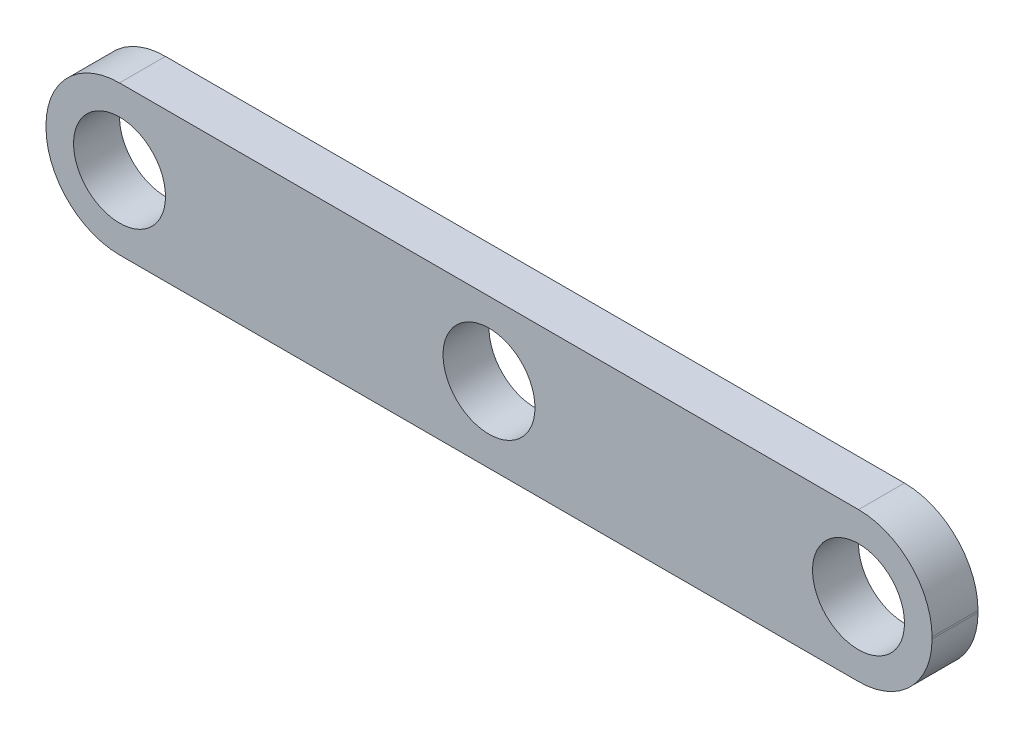
ISO-10303-21;
HEADER;
FILE_DESCRIPTION(('STEP AP214'),'2;1');
FILE_NAME('part.step','',(''),(''),'','','');
FILE_SCHEMA(('AUTOMOTIVE_DESIGN { 1 0 10303 214 1 1 1 1 }'));
ENDSEC;
DATA;
#1=APPLICATION_CONTEXT('core data for automotive mechanical design processes');
#2=APPLICATION_PROTOCOL_DEFINITION('international standard','automotive_design',2000,#1);
#3=PRODUCT_CONTEXT('',#1,'mechanical');
#4=PRODUCT('Part','Part','',(#3));
#5=PRODUCT_RELATED_PRODUCT_CATEGORY('part','',(#4));
#6=PRODUCT_DEFINITION_FORMATION('','',#4);
#7=PRODUCT_DEFINITION_CONTEXT('part definition',#1,'design');
#8=PRODUCT_DEFINITION('design','',#6,#7);
#9=PRODUCT_DEFINITION_SHAPE('','',#8);
#10=(LENGTH_UNIT() NAMED_UNIT(*) SI_UNIT(.MILLI.,.METRE.));
#11=(NAMED_UNIT(*) PLANE_ANGLE_UNIT() SI_UNIT($,.RADIAN.));
#12=(NAMED_UNIT(*) SI_UNIT($,.STERADIAN.) SOLID_ANGLE_UNIT());
#13=UNCERTAINTY_MEASURE_WITH_UNIT(LENGTH_MEASURE(1.E-05),#10,'distance_accuracy_value','');
#14=(GEOMETRIC_REPRESENTATION_CONTEXT(3) GLOBAL_UNCERTAINTY_ASSIGNED_CONTEXT((#13)) GLOBAL_UNIT_ASSIGNED_CONTEXT((#10,
#11,#12)) REPRESENTATION_CONTEXT('',''));
#15=CARTESIAN_POINT('',(0.,0.,0.));
#16=DIRECTION('',(0.,0.,1.));
#17=DIRECTION('',(1.,0.,0.));
#18=AXIS2_PLACEMENT_3D('',#15,#16,#17);
#19=CARTESIAN_POINT('',(-80.7734535156808,-21.6068840336135,10.));
#20=DIRECTION('',(0.,0.,1.));
#21=DIRECTION('',(1.,0.,0.));
#22=AXIS2_PLACEMENT_3D('',#19,#20,#21);
#23=PLANE('',#22);
#24=CARTESIAN_POINT('',(-0.370619440874409,-21.1882318668644,10.));
#25=DIRECTION('',(0.,0.,1.));
#26=DIRECTION('',(1.,0.,0.));
#27=AXIS2_PLACEMENT_3D('',#24,#25,#26);
#28=CIRCLE('',#27,9.99999999999999);
#29=CARTESIAN_POINT('',(9.62938055912559,-21.1882318668644,10.));
#30=VERTEX_POINT('',#29);
#31=EDGE_CURVE('E213',#30,#30,#28,.T.);
#32=ORIENTED_EDGE('',*,*,#31,.F.);
#33=EDGE_LOOP('',(#32));
#34=FACE_BOUND('',#33,.T.);
#35=CARTESIAN_POINT('',(-80.7734535156808,-21.6068840336135,10.));
#36=DIRECTION('',(0.,0.,1.));
#37=DIRECTION('',(1.,0.,0.));
#38=AXIS2_PLACEMENT_3D('',#35,#36,#37);
#39=CIRCLE('',#38,16.);
#40=CARTESIAN_POINT('',(-96.7734535156808,-21.6068840336135,10.));
#41=VERTEX_POINT('',#40);
#42=CARTESIAN_POINT('',(-80.7734535156808,-37.6068840336135,10.));
#43=VERTEX_POINT('',#42);
#44=EDGE_CURVE('E164',#41,#43,#39,.T.);
#45=ORIENTED_EDGE('',*,*,#44,.T.);
#46=DIRECTION('',(1.,0.,0.));
#47=VECTOR('',#46,1.);
#48=CARTESIAN_POINT('',(-80.7734535156808,-37.6068840336135,10.));
#49=LINE('',#48,#47);
#50=CARTESIAN_POINT('',(80.032214633932,-37.6068840336135,10.));
#51=VERTEX_POINT('',#50);
#52=EDGE_CURVE('E100',#43,#51,#49,.T.);
#53=ORIENTED_EDGE('',*,*,#52,.T.);
#54=CARTESIAN_POINT('',(80.032214633932,-21.6068840336134,10.));
#55=DIRECTION('',(0.,0.,1.));
#56=DIRECTION('',(1.,0.,0.));
#57=AXIS2_PLACEMENT_3D('',#54,#55,#56);
#58=CIRCLE('',#57,16.);
#59=CARTESIAN_POINT('',(96.032214633932,-21.6068840336134,10.));
#60=VERTEX_POINT('',#59);
#61=EDGE_CURVE('E185',#51,#60,#58,.T.);
#62=ORIENTED_EDGE('',*,*,#61,.T.);
#63=DIRECTION('',(0.,1.,0.));
#64=VECTOR('',#63,1.);
#65=CARTESIAN_POINT('',(96.032214633932,-21.1882318668644,10.));
#66=LINE('',#65,#64);
#67=CARTESIAN_POINT('',(96.032214633932,-21.1882318668644,10.));
#68=VERTEX_POINT('',#67);
#69=EDGE_CURVE('E199',#60,#68,#66,.T.);
#70=ORIENTED_EDGE('',*,*,#69,.T.);
#71=CARTESIAN_POINT('',(80.032214633932,-21.1882318668644,10.));
#72=DIRECTION('',(0.,0.,1.));
#73=DIRECTION('',(-1.,0.,0.));
#74=AXIS2_PLACEMENT_3D('',#71,#72,#73);
#75=CIRCLE('',#74,16.);
#76=CARTESIAN_POINT('',(80.032214633932,-5.1882318668644,10.));
#77=VERTEX_POINT('',#76);
#78=EDGE_CURVE('E119',#68,#77,#75,.T.);
#79=ORIENTED_EDGE('',*,*,#78,.T.);
#80=DIRECTION('',(-1.,0.,0.));
#81=VECTOR('',#80,1.);
#82=CARTESIAN_POINT('',(-80.7734535156808,-5.1882318668644,10.));
#83=LINE('',#82,#81);
#84=CARTESIAN_POINT('',(-80.7734535156808,-5.1882318668644,10.));
#85=VERTEX_POINT('',#84);
#86=EDGE_CURVE('E113',#77,#85,#83,.T.);
#87=ORIENTED_EDGE('',*,*,#86,.T.);
#88=CARTESIAN_POINT('',(-80.7734535156808,-21.1882318668644,10.));
#89=DIRECTION('',(0.,0.,1.));
#90=DIRECTION('',(1.,0.,0.));
#91=AXIS2_PLACEMENT_3D('',#88,#89,#90);
#92=CIRCLE('',#91,16.);
#93=CARTESIAN_POINT('',(-96.7734535156808,-21.1882318668644,10.));
#94=VERTEX_POINT('',#93);
#95=EDGE_CURVE('E117',#85,#94,#92,.T.);
#96=ORIENTED_EDGE('',*,*,#95,.T.);
#97=DIRECTION('',(0.,-1.,0.));
#98=VECTOR('',#97,1.);
#99=CARTESIAN_POINT('',(-96.7734535156808,-21.1882318668644,10.));
#100=LINE('',#99,#98);
#101=EDGE_CURVE('E57',#94,#41,#100,.T.);
#102=ORIENTED_EDGE('',*,*,#101,.T.);
#103=EDGE_LOOP('',(#45,#53,#62,#70,#79,#87,#96,#102));
#104=FACE_BOUND('',#103,.T.);
#105=CARTESIAN_POINT('',(-80.7734535156808,-21.6068840336135,10.));
#106=DIRECTION('',(0.,0.,1.));
#107=DIRECTION('',(1.,0.,0.));
#108=AXIS2_PLACEMENT_3D('',#105,#106,#107);
#109=CIRCLE('',#108,9.99999999999999);
#110=CARTESIAN_POINT('',(-70.7734535156808,-21.6068840336135,10.));
#111=VERTEX_POINT('',#110);
#112=EDGE_CURVE('E146',#111,#111,#109,.T.);
#113=ORIENTED_EDGE('',*,*,#112,.F.);
#114=EDGE_LOOP('',(#113));
#115=FACE_BOUND('',#114,.T.);
#116=CARTESIAN_POINT('',(80.032214633932,-21.6068840336134,10.));
#117=DIRECTION('',(0.,0.,1.));
#118=DIRECTION('',(1.,0.,0.));
#119=AXIS2_PLACEMENT_3D('',#116,#117,#118);
#120=CIRCLE('',#119,9.99999999999999);
#121=CARTESIAN_POINT('',(90.032214633932,-21.6068840336134,10.));
#122=VERTEX_POINT('',#121);
#123=EDGE_CURVE('E221',#122,#122,#120,.T.);
#124=ORIENTED_EDGE('',*,*,#123,.F.);
#125=EDGE_LOOP('',(#124));
#126=FACE_BOUND('',#125,.T.);
#127=ADVANCED_FACE('F39',(#34,#104,#115,#126),#23,.T.);
#128=CARTESIAN_POINT('',(-80.7734535156808,-21.6068840336135,0.));
#129=DIRECTION('',(0.,0.,1.));
#130=DIRECTION('',(1.,0.,0.));
#131=AXIS2_PLACEMENT_3D('',#128,#129,#130);
#132=PLANE('',#131);
#133=CARTESIAN_POINT('',(-80.7734535156808,-21.6068840336135,0.));
#134=DIRECTION('',(0.,0.,1.));
#135=DIRECTION('',(1.,0.,0.));
#136=AXIS2_PLACEMENT_3D('',#133,#134,#135);
#137=CIRCLE('',#136,16.);
#138=CARTESIAN_POINT('',(-96.7734535156808,-21.6068840336135,0.));
#139=VERTEX_POINT('',#138);
#140=CARTESIAN_POINT('',(-80.7734535156808,-37.6068840336135,0.));
#141=VERTEX_POINT('',#140);
#142=EDGE_CURVE('E141',#139,#141,#137,.T.);
#143=ORIENTED_EDGE('',*,*,#142,.F.);
#144=DIRECTION('',(0.,-1.,0.));
#145=VECTOR('',#144,1.);
#146=CARTESIAN_POINT('',(-96.7734535156808,-21.1882318668644,0.));
#147=LINE('',#146,#145);
#148=CARTESIAN_POINT('',(-96.7734535156808,-21.1882318668644,0.));
#149=VERTEX_POINT('',#148);
#150=EDGE_CURVE('E92',#149,#139,#147,.T.);
#151=ORIENTED_EDGE('',*,*,#150,.F.);
#152=CARTESIAN_POINT('',(-80.7734535156808,-21.1882318668644,0.));
#153=DIRECTION('',(0.,0.,1.));
#154=DIRECTION('',(1.,0.,0.));
#155=AXIS2_PLACEMENT_3D('',#152,#153,#154);
#156=CIRCLE('',#155,16.);
#157=CARTESIAN_POINT('',(-80.7734535156808,-5.1882318668644,0.));
#158=VERTEX_POINT('',#157);
#159=EDGE_CURVE('E86',#158,#149,#156,.T.);
#160=ORIENTED_EDGE('',*,*,#159,.F.);
#161=DIRECTION('',(-1.,0.,0.));
#162=VECTOR('',#161,1.);
#163=CARTESIAN_POINT('',(-80.7734535156808,-5.1882318668644,0.));
#164=LINE('',#163,#162);
#165=CARTESIAN_POINT('',(80.032214633932,-5.1882318668644,0.));
#166=VERTEX_POINT('',#165);
#167=EDGE_CURVE('E128',#166,#158,#164,.T.);
#168=ORIENTED_EDGE('',*,*,#167,.F.);
#169=CARTESIAN_POINT('',(80.032214633932,-21.1882318668644,0.));
#170=DIRECTION('',(0.,0.,1.));
#171=DIRECTION('',(-1.,0.,0.));
#172=AXIS2_PLACEMENT_3D('',#169,#170,#171);
#173=CIRCLE('',#172,16.);
#174=CARTESIAN_POINT('',(96.032214633932,-21.1882318668644,0.));
#175=VERTEX_POINT('',#174);
#176=EDGE_CURVE('E155',#175,#166,#173,.T.);
#177=ORIENTED_EDGE('',*,*,#176,.F.);
#178=DIRECTION('',(0.,1.,0.));
#179=VECTOR('',#178,1.);
#180=CARTESIAN_POINT('',(96.032214633932,-21.1882318668644,0.));
#181=LINE('',#180,#179);
#182=CARTESIAN_POINT('',(96.032214633932,-21.6068840336134,0.));
#183=VERTEX_POINT('',#182);
#184=EDGE_CURVE('E152',#183,#175,#181,.T.);
#185=ORIENTED_EDGE('',*,*,#184,.F.);
#186=CARTESIAN_POINT('',(80.032214633932,-21.6068840336134,0.));
#187=DIRECTION('',(0.,0.,1.));
#188=DIRECTION('',(1.,0.,0.));
#189=AXIS2_PLACEMENT_3D('',#186,#187,#188);
#190=CIRCLE('',#189,16.);
#191=CARTESIAN_POINT('',(80.032214633932,-37.6068840336135,0.));
#192=VERTEX_POINT('',#191);
#193=EDGE_CURVE('E149',#192,#183,#190,.T.);
#194=ORIENTED_EDGE('',*,*,#193,.F.);
#195=DIRECTION('',(1.,0.,0.));
#196=VECTOR('',#195,1.);
#197=CARTESIAN_POINT('',(-80.7734535156808,-37.6068840336135,0.));
#198=LINE('',#197,#196);
#199=EDGE_CURVE('E145',#141,#192,#198,.T.);
#200=ORIENTED_EDGE('',*,*,#199,.F.);
#201=EDGE_LOOP('',(#143,#151,#160,#168,#177,#185,#194,#200));
#202=FACE_BOUND('',#201,.T.);
#203=CARTESIAN_POINT('',(-80.7734535156808,-21.6068840336135,0.));
#204=DIRECTION('',(0.,0.,1.));
#205=DIRECTION('',(1.,0.,0.));
#206=AXIS2_PLACEMENT_3D('',#203,#204,#205);
#207=CIRCLE('',#206,9.99999999999999);
#208=CARTESIAN_POINT('',(-70.7734535156808,-21.6068840336135,0.));
#209=VERTEX_POINT('',#208);
#210=EDGE_CURVE('E209',#209,#209,#207,.T.);
#211=ORIENTED_EDGE('',*,*,#210,.T.);
#212=EDGE_LOOP('',(#211));
#213=FACE_BOUND('',#212,.T.);
#214=CARTESIAN_POINT('',(-0.370619440874409,-21.1882318668644,0.));
#215=DIRECTION('',(0.,0.,1.));
#216=DIRECTION('',(1.,0.,0.));
#217=AXIS2_PLACEMENT_3D('',#214,#215,#216);
#218=CIRCLE('',#217,9.99999999999999);
#219=CARTESIAN_POINT('',(9.62938055912559,-21.1882318668644,0.));
#220=VERTEX_POINT('',#219);
#221=EDGE_CURVE('E217',#220,#220,#218,.T.);
#222=ORIENTED_EDGE('',*,*,#221,.T.);
#223=EDGE_LOOP('',(#222));
#224=FACE_BOUND('',#223,.T.);
#225=CARTESIAN_POINT('',(80.032214633932,-21.6068840336134,0.));
#226=DIRECTION('',(0.,0.,1.));
#227=DIRECTION('',(1.,0.,0.));
#228=AXIS2_PLACEMENT_3D('',#225,#226,#227);
#229=CIRCLE('',#228,9.99999999999999);
#230=CARTESIAN_POINT('',(90.032214633932,-21.6068840336134,0.));
#231=VERTEX_POINT('',#230);
#232=EDGE_CURVE('E225',#231,#231,#229,.T.);
#233=ORIENTED_EDGE('',*,*,#232,.T.);
#234=EDGE_LOOP('',(#233));
#235=FACE_BOUND('',#234,.T.);
#236=ADVANCED_FACE('F189',(#202,#213,#224,#235),#132,.F.);
#237=CARTESIAN_POINT('',(-80.7734535156808,-21.6068840336135,10.));
#238=DIRECTION('',(0.,0.,-1.));
#239=DIRECTION('',(-1.,0.,0.));
#240=AXIS2_PLACEMENT_3D('',#237,#238,#239);
#241=CYLINDRICAL_SURFACE('',#240,16.);
#242=ORIENTED_EDGE('',*,*,#142,.T.);
#243=DIRECTION('',(0.,0.,-1.));
#244=VECTOR('',#243,1.);
#245=CARTESIAN_POINT('',(-80.7734535156808,-37.6068840336135,10.));
#246=LINE('',#245,#244);
#247=EDGE_CURVE('E11',#43,#141,#246,.T.);
#248=ORIENTED_EDGE('',*,*,#247,.F.);
#249=ORIENTED_EDGE('',*,*,#44,.F.);
#250=DIRECTION('',(0.,0.,-1.));
#251=VECTOR('',#250,1.);
#252=CARTESIAN_POINT('',(-96.7734535156808,-21.6068840336135,10.));
#253=LINE('',#252,#251);
#254=EDGE_CURVE('E137',#41,#139,#253,.T.);
#255=ORIENTED_EDGE('',*,*,#254,.T.);
#256=EDGE_LOOP('',(#242,#248,#249,#255));
#257=FACE_BOUND('',#256,.T.);
#258=ADVANCED_FACE('F41',(#257),#241,.T.);
#259=CARTESIAN_POINT('',(-80.7734535156808,-37.6068840336135,10.));
#260=DIRECTION('',(0.,1.,0.));
#261=DIRECTION('',(0.,0.,1.));
#262=AXIS2_PLACEMENT_3D('',#259,#260,#261);
#263=PLANE('',#262);
#264=ORIENTED_EDGE('',*,*,#199,.T.);
#265=DIRECTION('',(0.,0.,-1.));
#266=VECTOR('',#265,1.);
#267=CARTESIAN_POINT('',(80.032214633932,-37.6068840336135,10.));
#268=LINE('',#267,#266);
#269=EDGE_CURVE('E49',#51,#192,#268,.T.);
#270=ORIENTED_EDGE('',*,*,#269,.F.);
#271=ORIENTED_EDGE('',*,*,#52,.F.);
#272=ORIENTED_EDGE('',*,*,#247,.T.);
#273=EDGE_LOOP('',(#264,#270,#271,#272));
#274=FACE_BOUND('',#273,.T.);
#275=ADVANCED_FACE('F260',(#274),#263,.F.);
#276=CARTESIAN_POINT('',(80.032214633932,-21.6068840336134,10.));
#277=DIRECTION('',(0.,0.,-1.));
#278=DIRECTION('',(-1.,0.,0.));
#279=AXIS2_PLACEMENT_3D('',#276,#277,#278);
#280=CYLINDRICAL_SURFACE('',#279,16.);
#281=ORIENTED_EDGE('',*,*,#193,.T.);
#282=DIRECTION('',(0.,0.,-1.));
#283=VECTOR('',#282,1.);
#284=CARTESIAN_POINT('',(96.032214633932,-21.6068840336134,10.));
#285=LINE('',#284,#283);
#286=EDGE_CURVE('E175',#60,#183,#285,.T.);
#287=ORIENTED_EDGE('',*,*,#286,.F.);
#288=ORIENTED_EDGE('',*,*,#61,.F.);
#289=ORIENTED_EDGE('',*,*,#269,.T.);
#290=EDGE_LOOP('',(#281,#287,#288,#289));
#291=FACE_BOUND('',#290,.T.);
#292=ADVANCED_FACE('F183',(#291),#280,.T.);
#293=CARTESIAN_POINT('',(96.032214633932,-21.1882318668644,10.));
#294=DIRECTION('',(-1.,0.,0.));
#295=DIRECTION('',(0.,0.,1.));
#296=AXIS2_PLACEMENT_3D('',#293,#294,#295);
#297=PLANE('',#296);
#298=ORIENTED_EDGE('',*,*,#184,.T.);
#299=DIRECTION('',(0.,0.,-1.));
#300=VECTOR('',#299,1.);
#301=CARTESIAN_POINT('',(96.032214633932,-21.1882318668644,10.));
#302=LINE('',#301,#300);
#303=EDGE_CURVE('E171',#68,#175,#302,.T.);
#304=ORIENTED_EDGE('',*,*,#303,.F.);
#305=ORIENTED_EDGE('',*,*,#69,.F.);
#306=ORIENTED_EDGE('',*,*,#286,.T.);
#307=EDGE_LOOP('',(#298,#304,#305,#306));
#308=FACE_BOUND('',#307,.T.);
#309=ADVANCED_FACE('F194',(#308),#297,.F.);
#310=CARTESIAN_POINT('',(80.032214633932,-21.1882318668644,10.));
#311=DIRECTION('',(0.,0.,-1.));
#312=DIRECTION('',(-1.,0.,0.));
#313=AXIS2_PLACEMENT_3D('',#310,#311,#312);
#314=CYLINDRICAL_SURFACE('',#313,16.);
#315=ORIENTED_EDGE('',*,*,#176,.T.);
#316=DIRECTION('',(0.,0.,-1.));
#317=VECTOR('',#316,1.);
#318=CARTESIAN_POINT('',(80.032214633932,-5.1882318668644,10.));
#319=LINE('',#318,#317);
#320=EDGE_CURVE('E130',#77,#166,#319,.T.);
#321=ORIENTED_EDGE('',*,*,#320,.F.);
#322=ORIENTED_EDGE('',*,*,#78,.F.);
#323=ORIENTED_EDGE('',*,*,#303,.T.);
#324=EDGE_LOOP('',(#315,#321,#322,#323));
#325=FACE_BOUND('',#324,.T.);
#326=ADVANCED_FACE('F197',(#325),#314,.T.);
#327=CARTESIAN_POINT('',(-80.7734535156808,-5.1882318668644,10.));
#328=DIRECTION('',(0.,-1.,0.));
#329=DIRECTION('',(0.,0.,-1.));
#330=AXIS2_PLACEMENT_3D('',#327,#328,#329);
#331=PLANE('',#330);
#332=ORIENTED_EDGE('',*,*,#167,.T.);
#333=DIRECTION('',(0.,0.,-1.));
#334=VECTOR('',#333,1.);
#335=CARTESIAN_POINT('',(-80.7734535156808,-5.1882318668644,10.));
#336=LINE('',#335,#334);
#337=EDGE_CURVE('E125',#85,#158,#336,.T.);
#338=ORIENTED_EDGE('',*,*,#337,.F.);
#339=ORIENTED_EDGE('',*,*,#86,.F.);
#340=ORIENTED_EDGE('',*,*,#320,.T.);
#341=EDGE_LOOP('',(#332,#338,#339,#340));
#342=FACE_BOUND('',#341,.T.);
#343=ADVANCED_FACE('F126',(#342),#331,.F.);
#344=CARTESIAN_POINT('',(-80.7734535156808,-21.1882318668644,10.));
#345=DIRECTION('',(0.,0.,-1.));
#346=DIRECTION('',(-1.,0.,0.));
#347=AXIS2_PLACEMENT_3D('',#344,#345,#346);
#348=CYLINDRICAL_SURFACE('',#347,16.);
#349=ORIENTED_EDGE('',*,*,#159,.T.);
#350=DIRECTION('',(0.,0.,-1.));
#351=VECTOR('',#350,1.);
#352=CARTESIAN_POINT('',(-96.7734535156808,-21.1882318668644,10.));
#353=LINE('',#352,#351);
#354=EDGE_CURVE('E131',#94,#149,#353,.T.);
#355=ORIENTED_EDGE('',*,*,#354,.F.);
#356=ORIENTED_EDGE('',*,*,#95,.F.);
#357=ORIENTED_EDGE('',*,*,#337,.T.);
#358=EDGE_LOOP('',(#349,#355,#356,#357));
#359=FACE_BOUND('',#358,.T.);
#360=ADVANCED_FACE('F133',(#359),#348,.T.);
#361=CARTESIAN_POINT('',(-96.7734535156808,-21.1882318668644,10.));
#362=DIRECTION('',(1.,0.,0.));
#363=DIRECTION('',(0.,0.,-1.));
#364=AXIS2_PLACEMENT_3D('',#361,#362,#363);
#365=PLANE('',#364);
#366=ORIENTED_EDGE('',*,*,#150,.T.);
#367=ORIENTED_EDGE('',*,*,#254,.F.);
#368=ORIENTED_EDGE('',*,*,#101,.F.);
#369=ORIENTED_EDGE('',*,*,#354,.T.);
#370=EDGE_LOOP('',(#366,#367,#368,#369));
#371=FACE_BOUND('',#370,.T.);
#372=ADVANCED_FACE('F248',(#371),#365,.F.);
#373=CARTESIAN_POINT('',(-80.7734535156808,-21.6068840336135,10.));
#374=DIRECTION('',(0.,0.,-1.));
#375=DIRECTION('',(-1.,0.,0.));
#376=AXIS2_PLACEMENT_3D('',#373,#374,#375);
#377=CYLINDRICAL_SURFACE('',#376,9.99999999999999);
#378=ORIENTED_EDGE('',*,*,#112,.T.);
#379=EDGE_LOOP('',(#378));
#380=FACE_BOUND('',#379,.T.);
#381=ORIENTED_EDGE('',*,*,#210,.F.);
#382=EDGE_LOOP('',(#381));
#383=FACE_BOUND('',#382,.T.);
#384=ADVANCED_FACE('F245',(#380,#383),#377,.F.);
#385=CARTESIAN_POINT('',(-0.370619440874409,-21.1882318668644,10.));
#386=DIRECTION('',(0.,0.,-1.));
#387=DIRECTION('',(-1.,0.,0.));
#388=AXIS2_PLACEMENT_3D('',#385,#386,#387);
#389=CYLINDRICAL_SURFACE('',#388,9.99999999999999);
#390=ORIENTED_EDGE('',*,*,#31,.T.);
#391=EDGE_LOOP('',(#390));
#392=FACE_BOUND('',#391,.T.);
#393=ORIENTED_EDGE('',*,*,#221,.F.);
#394=EDGE_LOOP('',(#393));
#395=FACE_BOUND('',#394,.T.);
#396=ADVANCED_FACE('F324',(#392,#395),#389,.F.);
#397=CARTESIAN_POINT('',(80.032214633932,-21.6068840336134,10.));
#398=DIRECTION('',(0.,0.,-1.));
#399=DIRECTION('',(-1.,0.,0.));
#400=AXIS2_PLACEMENT_3D('',#397,#398,#399);
#401=CYLINDRICAL_SURFACE('',#400,9.99999999999999);
#402=ORIENTED_EDGE('',*,*,#123,.T.);
#403=EDGE_LOOP('',(#402));
#404=FACE_BOUND('',#403,.T.);
#405=ORIENTED_EDGE('',*,*,#232,.F.);
#406=EDGE_LOOP('',(#405));
#407=FACE_BOUND('',#406,.T.);
#408=ADVANCED_FACE('F233',(#404,#407),#401,.F.);
#409=CLOSED_SHELL('',(#127,#236,#258,#275,#292,#309,#326,#343,#360,#372,#384,#396,#408));
#410=MANIFOLD_SOLID_BREP('B2',#409);
#411=ADVANCED_BREP_SHAPE_REPRESENTATION('',(#18,#410),#14);
#412=SHAPE_DEFINITION_REPRESENTATION(#9,#411);
ENDSEC;
END-ISO-10303-21;
